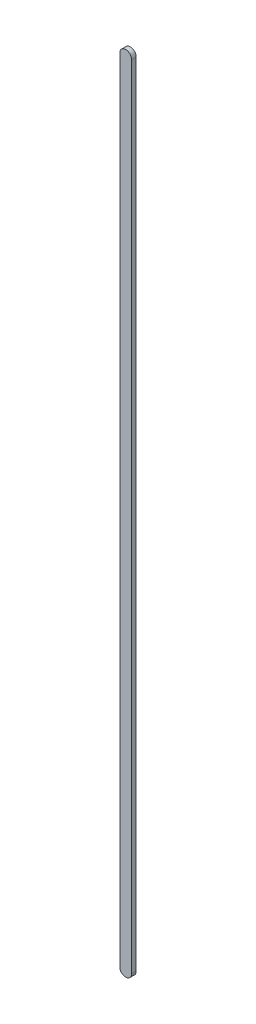
ISO-10303-21;
HEADER;
FILE_DESCRIPTION(('STEP AP214'),'2;1');
FILE_NAME('part.step','',(''),(''),'','','');
FILE_SCHEMA(('AUTOMOTIVE_DESIGN { 1 0 10303 214 1 1 1 1 }'));
ENDSEC;
DATA;
#1=APPLICATION_CONTEXT('core data for automotive mechanical design processes');
#2=APPLICATION_PROTOCOL_DEFINITION('international standard','automotive_design',2000,#1);
#3=PRODUCT_CONTEXT('',#1,'mechanical');
#4=PRODUCT('Part','Part','',(#3));
#5=PRODUCT_RELATED_PRODUCT_CATEGORY('part','',(#4));
#6=PRODUCT_DEFINITION_FORMATION('','',#4);
#7=PRODUCT_DEFINITION_CONTEXT('part definition',#1,'design');
#8=PRODUCT_DEFINITION('design','',#6,#7);
#9=PRODUCT_DEFINITION_SHAPE('','',#8);
#10=(LENGTH_UNIT() NAMED_UNIT(*) SI_UNIT(.MILLI.,.METRE.));
#11=(NAMED_UNIT(*) PLANE_ANGLE_UNIT() SI_UNIT($,.RADIAN.));
#12=(NAMED_UNIT(*) SI_UNIT($,.STERADIAN.) SOLID_ANGLE_UNIT());
#13=UNCERTAINTY_MEASURE_WITH_UNIT(LENGTH_MEASURE(1.E-05),#10,'distance_accuracy_value','');
#14=(GEOMETRIC_REPRESENTATION_CONTEXT(3) GLOBAL_UNCERTAINTY_ASSIGNED_CONTEXT((#13)) GLOBAL_UNIT_ASSIGNED_CONTEXT((#10,
#11,#12)) REPRESENTATION_CONTEXT('',''));
#15=CARTESIAN_POINT('',(0.,0.,0.));
#16=DIRECTION('',(0.,0.,1.));
#17=DIRECTION('',(1.,0.,0.));
#18=AXIS2_PLACEMENT_3D('',#15,#16,#17);
#19=CARTESIAN_POINT('',(85.725,56.642,0.));
#20=DIRECTION('',(-1.,0.,0.));
#21=DIRECTION('',(0.,1.,0.));
#22=AXIS2_PLACEMENT_3D('',#19,#20,#21);
#23=PLANE('',#22);
#24=DIRECTION('',(0.,1.,0.));
#25=VECTOR('',#24,1.);
#26=CARTESIAN_POINT('',(85.725,56.642,0.1999996));
#27=LINE('',#26,#25);
#28=CARTESIAN_POINT('',(85.725,56.642,0.1999996));
#29=VERTEX_POINT('',#28);
#30=CARTESIAN_POINT('',(85.725,90.61263056,0.1999996));
#31=VERTEX_POINT('',#30);
#32=EDGE_CURVE('E11',#29,#31,#27,.T.);
#33=ORIENTED_EDGE('',*,*,#32,.F.);
#34=DIRECTION('',(0.,0.,1.));
#35=VECTOR('',#34,1.);
#36=CARTESIAN_POINT('',(85.725,56.642,0.));
#37=LINE('',#36,#35);
#38=CARTESIAN_POINT('',(85.725,56.642,0.));
#39=VERTEX_POINT('',#38);
#40=EDGE_CURVE('E24',#39,#29,#37,.T.);
#41=ORIENTED_EDGE('',*,*,#40,.F.);
#42=DIRECTION('',(0.,1.,0.));
#43=VECTOR('',#42,1.);
#44=CARTESIAN_POINT('',(85.725,56.642,0.));
#45=LINE('',#44,#43);
#46=CARTESIAN_POINT('',(85.725,90.61263056,0.));
#47=VERTEX_POINT('',#46);
#48=EDGE_CURVE('E75',#39,#47,#45,.T.);
#49=ORIENTED_EDGE('',*,*,#48,.T.);
#50=DIRECTION('',(0.,0.,1.));
#51=VECTOR('',#50,1.);
#52=CARTESIAN_POINT('',(85.725,90.61263056,0.));
#53=LINE('',#52,#51);
#54=EDGE_CURVE('E37',#47,#31,#53,.T.);
#55=ORIENTED_EDGE('',*,*,#54,.T.);
#56=EDGE_LOOP('',(#33,#41,#49,#55));
#57=FACE_BOUND('',#56,.T.);
#58=ADVANCED_FACE('F17',(#57),#23,.F.);
#59=CARTESIAN_POINT('',(85.471,90.61263056,0.));
#60=DIRECTION('',(0.,0.,-1.));
#61=DIRECTION('',(1.,0.,0.));
#62=AXIS2_PLACEMENT_3D('',#59,#60,#61);
#63=CYLINDRICAL_SURFACE('',#62,0.254);
#64=CARTESIAN_POINT('',(85.471,90.61263056,0.1999996));
#65=DIRECTION('',(0.,0.,1.));
#66=DIRECTION('',(1.,0.,0.));
#67=AXIS2_PLACEMENT_3D('',#64,#65,#66);
#68=CIRCLE('',#67,0.254);
#69=CARTESIAN_POINT('',(85.217,90.61263056,0.1999996));
#70=VERTEX_POINT('',#69);
#71=EDGE_CURVE('E83',#31,#70,#68,.T.);
#72=ORIENTED_EDGE('',*,*,#71,.F.);
#73=ORIENTED_EDGE('',*,*,#54,.F.);
#74=CARTESIAN_POINT('',(85.471,90.61263056,0.));
#75=DIRECTION('',(0.,0.,1.));
#76=DIRECTION('',(1.,0.,0.));
#77=AXIS2_PLACEMENT_3D('',#74,#75,#76);
#78=CIRCLE('',#77,0.254);
#79=CARTESIAN_POINT('',(85.217,90.61263056,0.));
#80=VERTEX_POINT('',#79);
#81=EDGE_CURVE('E81',#47,#80,#78,.T.);
#82=ORIENTED_EDGE('',*,*,#81,.T.);
#83=DIRECTION('',(0.,0.,1.));
#84=VECTOR('',#83,1.);
#85=CARTESIAN_POINT('',(85.217,90.61263056,0.));
#86=LINE('',#85,#84);
#87=EDGE_CURVE('E67',#80,#70,#86,.T.);
#88=ORIENTED_EDGE('',*,*,#87,.T.);
#89=EDGE_LOOP('',(#72,#73,#82,#88));
#90=FACE_BOUND('',#89,.T.);
#91=ADVANCED_FACE('F89',(#90),#63,.T.);
#92=CARTESIAN_POINT('',(85.217,90.61263056,0.));
#93=DIRECTION('',(1.,0.,0.));
#94=DIRECTION('',(0.,-1.,0.));
#95=AXIS2_PLACEMENT_3D('',#92,#93,#94);
#96=PLANE('',#95);
#97=DIRECTION('',(0.,-1.,0.));
#98=VECTOR('',#97,1.);
#99=CARTESIAN_POINT('',(85.217,90.61263056,0.1999996));
#100=LINE('',#99,#98);
#101=CARTESIAN_POINT('',(85.217,56.642,0.1999996));
#102=VERTEX_POINT('',#101);
#103=EDGE_CURVE('E71',#70,#102,#100,.T.);
#104=ORIENTED_EDGE('',*,*,#103,.F.);
#105=ORIENTED_EDGE('',*,*,#87,.F.);
#106=DIRECTION('',(0.,-1.,0.));
#107=VECTOR('',#106,1.);
#108=CARTESIAN_POINT('',(85.217,90.61263056,0.));
#109=LINE('',#108,#107);
#110=CARTESIAN_POINT('',(85.217,56.642,0.));
#111=VERTEX_POINT('',#110);
#112=EDGE_CURVE('E63',#80,#111,#109,.T.);
#113=ORIENTED_EDGE('',*,*,#112,.T.);
#114=DIRECTION('',(0.,0.,1.));
#115=VECTOR('',#114,1.);
#116=CARTESIAN_POINT('',(85.217,56.642,0.));
#117=LINE('',#116,#115);
#118=EDGE_CURVE('E53',#111,#102,#117,.T.);
#119=ORIENTED_EDGE('',*,*,#118,.T.);
#120=EDGE_LOOP('',(#104,#105,#113,#119));
#121=FACE_BOUND('',#120,.T.);
#122=ADVANCED_FACE('F66',(#121),#96,.F.);
#123=CARTESIAN_POINT('',(85.471,56.642,0.));
#124=DIRECTION('',(0.,0.,-1.));
#125=DIRECTION('',(-1.,0.,0.));
#126=AXIS2_PLACEMENT_3D('',#123,#124,#125);
#127=CYLINDRICAL_SURFACE('',#126,0.254);
#128=CARTESIAN_POINT('',(85.471,56.642,0.1999996));
#129=DIRECTION('',(0.,0.,1.));
#130=DIRECTION('',(-1.,0.,0.));
#131=AXIS2_PLACEMENT_3D('',#128,#129,#130);
#132=CIRCLE('',#131,0.254);
#133=EDGE_CURVE('E59',#102,#29,#132,.T.);
#134=ORIENTED_EDGE('',*,*,#133,.F.);
#135=ORIENTED_EDGE('',*,*,#118,.F.);
#136=CARTESIAN_POINT('',(85.471,56.642,0.));
#137=DIRECTION('',(0.,0.,1.));
#138=DIRECTION('',(-1.,0.,0.));
#139=AXIS2_PLACEMENT_3D('',#136,#137,#138);
#140=CIRCLE('',#139,0.254);
#141=EDGE_CURVE('E57',#111,#39,#140,.T.);
#142=ORIENTED_EDGE('',*,*,#141,.T.);
#143=ORIENTED_EDGE('',*,*,#40,.T.);
#144=EDGE_LOOP('',(#134,#135,#142,#143));
#145=FACE_BOUND('',#144,.T.);
#146=ADVANCED_FACE('F55',(#145),#127,.T.);
#147=CARTESIAN_POINT('',(85.725,56.642,0.));
#148=DIRECTION('',(0.,0.,-1.));
#149=DIRECTION('',(-1.,0.,0.));
#150=AXIS2_PLACEMENT_3D('',#147,#148,#149);
#151=PLANE('',#150);
#152=ORIENTED_EDGE('',*,*,#141,.F.);
#153=ORIENTED_EDGE('',*,*,#112,.F.);
#154=ORIENTED_EDGE('',*,*,#81,.F.);
#155=ORIENTED_EDGE('',*,*,#48,.F.);
#156=EDGE_LOOP('',(#152,#153,#154,#155));
#157=FACE_BOUND('',#156,.T.);
#158=ADVANCED_FACE('F74',(#157),#151,.T.);
#159=CARTESIAN_POINT('',(85.725,56.642,0.1999996));
#160=DIRECTION('',(0.,0.,-1.));
#161=DIRECTION('',(-1.,0.,0.));
#162=AXIS2_PLACEMENT_3D('',#159,#160,#161);
#163=PLANE('',#162);
#164=ORIENTED_EDGE('',*,*,#32,.T.);
#165=ORIENTED_EDGE('',*,*,#71,.T.);
#166=ORIENTED_EDGE('',*,*,#103,.T.);
#167=ORIENTED_EDGE('',*,*,#133,.T.);
#168=EDGE_LOOP('',(#164,#165,#166,#167));
#169=FACE_BOUND('',#168,.T.);
#170=ADVANCED_FACE('F91',(#169),#163,.F.);
#171=CLOSED_SHELL('',(#58,#91,#122,#146,#158,#170));
#172=MANIFOLD_SOLID_BREP('B1',#171);
#173=ADVANCED_BREP_SHAPE_REPRESENTATION('',(#18,#172),#14);
#174=SHAPE_DEFINITION_REPRESENTATION(#9,#173);
ENDSEC;
END-ISO-10303-21;
